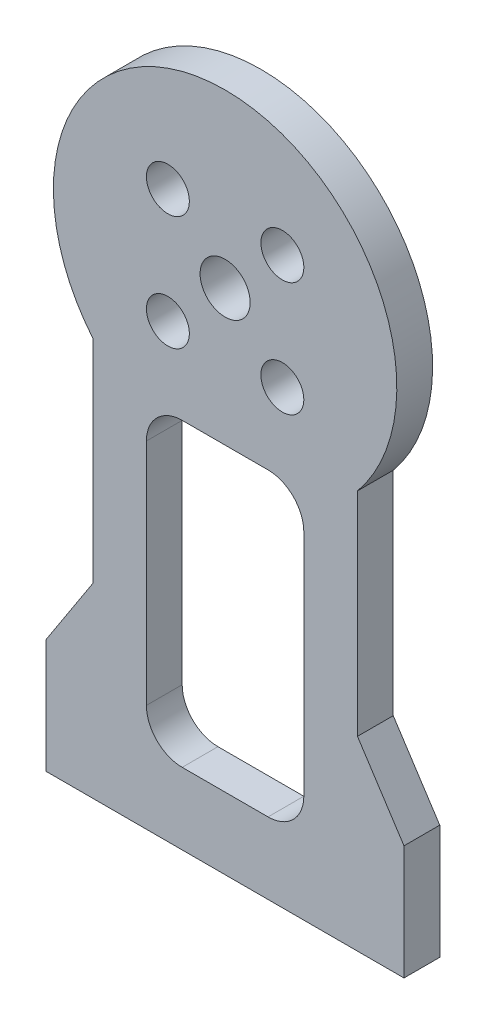
ISO-10303-21;
HEADER;
FILE_DESCRIPTION(('STEP AP214'),'2;1');
FILE_NAME('part.step','',(''),(''),'','','');
FILE_SCHEMA(('AUTOMOTIVE_DESIGN { 1 0 10303 214 1 1 1 1 }'));
ENDSEC;
DATA;
#1=APPLICATION_CONTEXT('core data for automotive mechanical design processes');
#2=APPLICATION_PROTOCOL_DEFINITION('international standard','automotive_design',2000,#1);
#3=PRODUCT_CONTEXT('',#1,'mechanical');
#4=PRODUCT('Part','Part','',(#3));
#5=PRODUCT_RELATED_PRODUCT_CATEGORY('part','',(#4));
#6=PRODUCT_DEFINITION_FORMATION('','',#4);
#7=PRODUCT_DEFINITION_CONTEXT('part definition',#1,'design');
#8=PRODUCT_DEFINITION('design','',#6,#7);
#9=PRODUCT_DEFINITION_SHAPE('','',#8);
#10=(LENGTH_UNIT() NAMED_UNIT(*) SI_UNIT(.MILLI.,.METRE.));
#11=(NAMED_UNIT(*) PLANE_ANGLE_UNIT() SI_UNIT($,.RADIAN.));
#12=(NAMED_UNIT(*) SI_UNIT($,.STERADIAN.) SOLID_ANGLE_UNIT());
#13=UNCERTAINTY_MEASURE_WITH_UNIT(LENGTH_MEASURE(1.E-05),#10,'distance_accuracy_value','');
#14=(GEOMETRIC_REPRESENTATION_CONTEXT(3) GLOBAL_UNCERTAINTY_ASSIGNED_CONTEXT((#13)) GLOBAL_UNIT_ASSIGNED_CONTEXT((#10,
#11,#12)) REPRESENTATION_CONTEXT('',''));
#15=CARTESIAN_POINT('',(0.,0.,0.));
#16=DIRECTION('',(0.,0.,1.));
#17=DIRECTION('',(1.,0.,0.));
#18=AXIS2_PLACEMENT_3D('',#15,#16,#17);
#19=CARTESIAN_POINT('',(0.,35.5,2.5));
#20=DIRECTION('',(0.,0.,1.));
#21=DIRECTION('',(1.,0.,0.));
#22=AXIS2_PLACEMENT_3D('',#19,#20,#21);
#23=PLANE('',#22);
#24=CARTESIAN_POINT('',(4.00000000000001,31.5,2.5));
#25=DIRECTION('',(0.,0.,1.));
#26=DIRECTION('',(1.,0.,0.));
#27=AXIS2_PLACEMENT_3D('',#24,#25,#26);
#28=CIRCLE('',#27,1.5);
#29=CARTESIAN_POINT('',(5.50000000000001,31.5,2.5));
#30=VERTEX_POINT('',#29);
#31=EDGE_CURVE('E391',#30,#30,#28,.T.);
#32=ORIENTED_EDGE('',*,*,#31,.F.);
#33=EDGE_LOOP('',(#32));
#34=FACE_BOUND('',#33,.T.);
#35=CARTESIAN_POINT('',(-4.,39.5,2.5));
#36=DIRECTION('',(0.,0.,1.));
#37=DIRECTION('',(1.,0.,0.));
#38=AXIS2_PLACEMENT_3D('',#35,#36,#37);
#39=CIRCLE('',#38,1.5);
#40=CARTESIAN_POINT('',(-2.5,39.5,2.5));
#41=VERTEX_POINT('',#40);
#42=EDGE_CURVE('E403',#41,#41,#39,.T.);
#43=ORIENTED_EDGE('',*,*,#42,.F.);
#44=EDGE_LOOP('',(#43));
#45=FACE_BOUND('',#44,.T.);
#46=DIRECTION('',(0.,1.,0.));
#47=VECTOR('',#46,1.);
#48=CARTESIAN_POINT('',(5.5,7.50000000000002,2.5));
#49=LINE('',#48,#47);
#50=CARTESIAN_POINT('',(5.5,7.50000000000002,2.5));
#51=VERTEX_POINT('',#50);
#52=CARTESIAN_POINT('',(5.5,23.5,2.5));
#53=VERTEX_POINT('',#52);
#54=EDGE_CURVE('E153',#51,#53,#49,.T.);
#55=ORIENTED_EDGE('',*,*,#54,.F.);
#56=CARTESIAN_POINT('',(3.,7.5,2.5));
#57=DIRECTION('',(0.,0.,1.));
#58=DIRECTION('',(1.,0.,0.));
#59=AXIS2_PLACEMENT_3D('',#56,#57,#58);
#60=CIRCLE('',#59,2.5);
#61=CARTESIAN_POINT('',(2.99999999999998,5.,2.5));
#62=VERTEX_POINT('',#61);
#63=EDGE_CURVE('E145',#62,#51,#60,.T.);
#64=ORIENTED_EDGE('',*,*,#63,.F.);
#65=DIRECTION('',(1.,0.,0.));
#66=VECTOR('',#65,1.);
#67=CARTESIAN_POINT('',(2.99999999999998,5.,2.5));
#68=LINE('',#67,#66);
#69=CARTESIAN_POINT('',(-2.99999999999998,5.,2.5));
#70=VERTEX_POINT('',#69);
#71=EDGE_CURVE('E180',#70,#62,#68,.T.);
#72=ORIENTED_EDGE('',*,*,#71,.F.);
#73=CARTESIAN_POINT('',(-3.,7.5,2.5));
#74=DIRECTION('',(0.,0.,1.));
#75=DIRECTION('',(-1.,0.,0.));
#76=AXIS2_PLACEMENT_3D('',#73,#74,#75);
#77=CIRCLE('',#76,2.5);
#78=CARTESIAN_POINT('',(-5.5,7.5,2.5));
#79=VERTEX_POINT('',#78);
#80=EDGE_CURVE('E178',#79,#70,#77,.T.);
#81=ORIENTED_EDGE('',*,*,#80,.F.);
#82=DIRECTION('',(0.,-1.,0.));
#83=VECTOR('',#82,1.);
#84=CARTESIAN_POINT('',(-5.5,7.50000000000002,2.5));
#85=LINE('',#84,#83);
#86=CARTESIAN_POINT('',(-5.5,23.5,2.5));
#87=VERTEX_POINT('',#86);
#88=EDGE_CURVE('E176',#87,#79,#85,.T.);
#89=ORIENTED_EDGE('',*,*,#88,.F.);
#90=CARTESIAN_POINT('',(-3.,23.5,2.5));
#91=DIRECTION('',(0.,0.,1.));
#92=DIRECTION('',(-1.,0.,0.));
#93=AXIS2_PLACEMENT_3D('',#90,#91,#92);
#94=CIRCLE('',#93,2.5);
#95=CARTESIAN_POINT('',(-2.99999999999998,26.,2.5));
#96=VERTEX_POINT('',#95);
#97=EDGE_CURVE('E174',#96,#87,#94,.T.);
#98=ORIENTED_EDGE('',*,*,#97,.F.);
#99=DIRECTION('',(-1.,0.,0.));
#100=VECTOR('',#99,1.);
#101=CARTESIAN_POINT('',(-2.99999999999998,26.,2.5));
#102=LINE('',#101,#100);
#103=CARTESIAN_POINT('',(2.99999999999998,26.,2.5));
#104=VERTEX_POINT('',#103);
#105=EDGE_CURVE('E169',#104,#96,#102,.T.);
#106=ORIENTED_EDGE('',*,*,#105,.F.);
#107=CARTESIAN_POINT('',(3.,23.5,2.5));
#108=DIRECTION('',(0.,0.,1.));
#109=DIRECTION('',(1.,0.,0.));
#110=AXIS2_PLACEMENT_3D('',#107,#108,#109);
#111=CIRCLE('',#110,2.5);
#112=EDGE_CURVE('E167',#53,#104,#111,.T.);
#113=ORIENTED_EDGE('',*,*,#112,.F.);
#114=EDGE_LOOP('',(#55,#64,#72,#81,#89,#98,#106,#113));
#115=FACE_BOUND('',#114,.T.);
#116=DIRECTION('',(0.,1.,0.));
#117=VECTOR('',#116,1.);
#118=CARTESIAN_POINT('',(12.5,0.,2.5));
#119=LINE('',#118,#117);
#120=CARTESIAN_POINT('',(12.5,0.,2.5));
#121=VERTEX_POINT('',#120);
#122=CARTESIAN_POINT('',(12.5,8.,2.5));
#123=VERTEX_POINT('',#122);
#124=EDGE_CURVE('E213',#121,#123,#119,.T.);
#125=ORIENTED_EDGE('',*,*,#124,.T.);
#126=DIRECTION('',(-0.544988350595414,0.838443616300637,0.));
#127=VECTOR('',#126,1.);
#128=CARTESIAN_POINT('',(12.5,8.,2.5));
#129=LINE('',#128,#127);
#130=CARTESIAN_POINT('',(9.25,13.,2.5));
#131=VERTEX_POINT('',#130);
#132=EDGE_CURVE('E216',#123,#131,#129,.T.);
#133=ORIENTED_EDGE('',*,*,#132,.T.);
#134=DIRECTION('',(0.,1.,0.));
#135=VECTOR('',#134,1.);
#136=CARTESIAN_POINT('',(9.25,13.,2.5));
#137=LINE('',#136,#135);
#138=CARTESIAN_POINT('',(9.24999999999999,27.8555575742897,2.5));
#139=VERTEX_POINT('',#138);
#140=EDGE_CURVE('E219',#131,#139,#137,.T.);
#141=ORIENTED_EDGE('',*,*,#140,.T.);
#142=CARTESIAN_POINT('',(0.,35.5,2.5));
#143=DIRECTION('',(0.,0.,1.));
#144=DIRECTION('',(1.,0.,0.));
#145=AXIS2_PLACEMENT_3D('',#142,#143,#144);
#146=CIRCLE('',#145,12.);
#147=CARTESIAN_POINT('',(-9.25,27.8555575742897,2.5));
#148=VERTEX_POINT('',#147);
#149=EDGE_CURVE('E221',#139,#148,#146,.T.);
#150=ORIENTED_EDGE('',*,*,#149,.T.);
#151=DIRECTION('',(0.,-1.,0.));
#152=VECTOR('',#151,1.);
#153=CARTESIAN_POINT('',(-9.25,13.,2.5));
#154=LINE('',#153,#152);
#155=CARTESIAN_POINT('',(-9.25,13.,2.5));
#156=VERTEX_POINT('',#155);
#157=EDGE_CURVE('E223',#148,#156,#154,.T.);
#158=ORIENTED_EDGE('',*,*,#157,.T.);
#159=DIRECTION('',(-0.544988350595414,-0.838443616300637,0.));
#160=VECTOR('',#159,1.);
#161=CARTESIAN_POINT('',(-12.5,8.,2.5));
#162=LINE('',#161,#160);
#163=CARTESIAN_POINT('',(-12.5,8.,2.5));
#164=VERTEX_POINT('',#163);
#165=EDGE_CURVE('E225',#156,#164,#162,.T.);
#166=ORIENTED_EDGE('',*,*,#165,.T.);
#167=DIRECTION('',(0.,-1.,0.));
#168=VECTOR('',#167,1.);
#169=CARTESIAN_POINT('',(-12.5,0.,2.5));
#170=LINE('',#169,#168);
#171=CARTESIAN_POINT('',(-12.5,0.,2.5));
#172=VERTEX_POINT('',#171);
#173=EDGE_CURVE('E227',#164,#172,#170,.T.);
#174=ORIENTED_EDGE('',*,*,#173,.T.);
#175=DIRECTION('',(1.,0.,0.));
#176=VECTOR('',#175,1.);
#177=CARTESIAN_POINT('',(12.5,0.,2.5));
#178=LINE('',#177,#176);
#179=EDGE_CURVE('E229',#172,#121,#178,.T.);
#180=ORIENTED_EDGE('',*,*,#179,.T.);
#181=EDGE_LOOP('',(#125,#133,#141,#150,#158,#166,#174,#180));
#182=FACE_BOUND('',#181,.T.);
#183=CARTESIAN_POINT('',(0.,35.5,2.5));
#184=DIRECTION('',(0.,0.,1.));
#185=DIRECTION('',(1.,0.,0.));
#186=AXIS2_PLACEMENT_3D('',#183,#184,#185);
#187=CIRCLE('',#186,1.75);
#188=CARTESIAN_POINT('',(1.75,35.5,2.5));
#189=VERTEX_POINT('',#188);
#190=EDGE_CURVE('E183',#189,#189,#187,.T.);
#191=ORIENTED_EDGE('',*,*,#190,.F.);
#192=EDGE_LOOP('',(#191));
#193=FACE_BOUND('',#192,.T.);
#194=CARTESIAN_POINT('',(-4.00000000000001,31.5,2.5));
#195=DIRECTION('',(0.,0.,1.));
#196=DIRECTION('',(-1.,0.,0.));
#197=AXIS2_PLACEMENT_3D('',#194,#195,#196);
#198=CIRCLE('',#197,1.5);
#199=CARTESIAN_POINT('',(-5.50000000000001,31.5,2.5));
#200=VERTEX_POINT('',#199);
#201=EDGE_CURVE('E397',#200,#200,#198,.T.);
#202=ORIENTED_EDGE('',*,*,#201,.F.);
#203=EDGE_LOOP('',(#202));
#204=FACE_BOUND('',#203,.T.);
#205=CARTESIAN_POINT('',(4.,39.5,2.5));
#206=DIRECTION('',(0.,0.,1.));
#207=DIRECTION('',(-1.,0.,0.));
#208=AXIS2_PLACEMENT_3D('',#205,#206,#207);
#209=CIRCLE('',#208,1.5);
#210=CARTESIAN_POINT('',(2.5,39.5,2.5));
#211=VERTEX_POINT('',#210);
#212=EDGE_CURVE('E382',#211,#211,#209,.T.);
#213=ORIENTED_EDGE('',*,*,#212,.F.);
#214=EDGE_LOOP('',(#213));
#215=FACE_BOUND('',#214,.T.);
#216=ADVANCED_FACE('F32',(#34,#45,#115,#182,#193,#204,#215),#23,.T.);
#217=CARTESIAN_POINT('',(0.,35.5,0.));
#218=DIRECTION('',(0.,0.,1.));
#219=DIRECTION('',(1.,0.,0.));
#220=AXIS2_PLACEMENT_3D('',#217,#218,#219);
#221=PLANE('',#220);
#222=DIRECTION('',(0.,1.,0.));
#223=VECTOR('',#222,1.);
#224=CARTESIAN_POINT('',(12.5,0.,0.));
#225=LINE('',#224,#223);
#226=CARTESIAN_POINT('',(12.5,0.,0.));
#227=VERTEX_POINT('',#226);
#228=CARTESIAN_POINT('',(12.5,8.,0.));
#229=VERTEX_POINT('',#228);
#230=EDGE_CURVE('E161',#227,#229,#225,.T.);
#231=ORIENTED_EDGE('',*,*,#230,.F.);
#232=DIRECTION('',(1.,0.,0.));
#233=VECTOR('',#232,1.);
#234=CARTESIAN_POINT('',(12.5,0.,0.));
#235=LINE('',#234,#233);
#236=CARTESIAN_POINT('',(-12.5,0.,0.));
#237=VERTEX_POINT('',#236);
#238=EDGE_CURVE('E217',#237,#227,#235,.T.);
#239=ORIENTED_EDGE('',*,*,#238,.F.);
#240=DIRECTION('',(0.,-1.,0.));
#241=VECTOR('',#240,1.);
#242=CARTESIAN_POINT('',(-12.5,0.,0.));
#243=LINE('',#242,#241);
#244=CARTESIAN_POINT('',(-12.5,8.,0.));
#245=VERTEX_POINT('',#244);
#246=EDGE_CURVE('E244',#245,#237,#243,.T.);
#247=ORIENTED_EDGE('',*,*,#246,.F.);
#248=DIRECTION('',(-0.544988350595414,-0.838443616300637,0.));
#249=VECTOR('',#248,1.);
#250=CARTESIAN_POINT('',(-12.5,8.,0.));
#251=LINE('',#250,#249);
#252=CARTESIAN_POINT('',(-9.25,13.,0.));
#253=VERTEX_POINT('',#252);
#254=EDGE_CURVE('E242',#253,#245,#251,.T.);
#255=ORIENTED_EDGE('',*,*,#254,.F.);
#256=DIRECTION('',(0.,-1.,0.));
#257=VECTOR('',#256,1.);
#258=CARTESIAN_POINT('',(-9.25,13.,0.));
#259=LINE('',#258,#257);
#260=CARTESIAN_POINT('',(-9.25,27.8555575742897,0.));
#261=VERTEX_POINT('',#260);
#262=EDGE_CURVE('E240',#261,#253,#259,.T.);
#263=ORIENTED_EDGE('',*,*,#262,.F.);
#264=CARTESIAN_POINT('',(0.,35.5,0.));
#265=DIRECTION('',(0.,0.,1.));
#266=DIRECTION('',(1.,0.,0.));
#267=AXIS2_PLACEMENT_3D('',#264,#265,#266);
#268=CIRCLE('',#267,12.);
#269=CARTESIAN_POINT('',(9.24999999999999,27.8555575742897,0.));
#270=VERTEX_POINT('',#269);
#271=EDGE_CURVE('E238',#270,#261,#268,.T.);
#272=ORIENTED_EDGE('',*,*,#271,.F.);
#273=DIRECTION('',(0.,1.,0.));
#274=VECTOR('',#273,1.);
#275=CARTESIAN_POINT('',(9.25,13.,0.));
#276=LINE('',#275,#274);
#277=CARTESIAN_POINT('',(9.25,13.,0.));
#278=VERTEX_POINT('',#277);
#279=EDGE_CURVE('E236',#278,#270,#276,.T.);
#280=ORIENTED_EDGE('',*,*,#279,.F.);
#281=DIRECTION('',(-0.544988350595414,0.838443616300637,0.));
#282=VECTOR('',#281,1.);
#283=CARTESIAN_POINT('',(12.5,8.,0.));
#284=LINE('',#283,#282);
#285=EDGE_CURVE('E234',#229,#278,#284,.T.);
#286=ORIENTED_EDGE('',*,*,#285,.F.);
#287=EDGE_LOOP('',(#231,#239,#247,#255,#263,#272,#280,#286));
#288=FACE_BOUND('',#287,.T.);
#289=CARTESIAN_POINT('',(3.,7.5,0.));
#290=DIRECTION('',(0.,0.,1.));
#291=DIRECTION('',(1.,0.,0.));
#292=AXIS2_PLACEMENT_3D('',#289,#290,#291);
#293=CIRCLE('',#292,2.5);
#294=CARTESIAN_POINT('',(2.99999999999998,5.,0.));
#295=VERTEX_POINT('',#294);
#296=CARTESIAN_POINT('',(5.5,7.50000000000002,0.));
#297=VERTEX_POINT('',#296);
#298=EDGE_CURVE('E55',#295,#297,#293,.T.);
#299=ORIENTED_EDGE('',*,*,#298,.T.);
#300=DIRECTION('',(0.,1.,0.));
#301=VECTOR('',#300,1.);
#302=CARTESIAN_POINT('',(5.5,7.50000000000002,0.));
#303=LINE('',#302,#301);
#304=CARTESIAN_POINT('',(5.5,23.5,0.));
#305=VERTEX_POINT('',#304);
#306=EDGE_CURVE('E160',#297,#305,#303,.T.);
#307=ORIENTED_EDGE('',*,*,#306,.T.);
#308=CARTESIAN_POINT('',(3.,23.5,0.));
#309=DIRECTION('',(0.,0.,1.));
#310=DIRECTION('',(1.,0.,0.));
#311=AXIS2_PLACEMENT_3D('',#308,#309,#310);
#312=CIRCLE('',#311,2.5);
#313=CARTESIAN_POINT('',(2.99999999999998,26.,0.));
#314=VERTEX_POINT('',#313);
#315=EDGE_CURVE('E185',#305,#314,#312,.T.);
#316=ORIENTED_EDGE('',*,*,#315,.T.);
#317=DIRECTION('',(-1.,0.,0.));
#318=VECTOR('',#317,1.);
#319=CARTESIAN_POINT('',(-2.99999999999998,26.,0.));
#320=LINE('',#319,#318);
#321=CARTESIAN_POINT('',(-2.99999999999998,26.,0.));
#322=VERTEX_POINT('',#321);
#323=EDGE_CURVE('E188',#314,#322,#320,.T.);
#324=ORIENTED_EDGE('',*,*,#323,.T.);
#325=CARTESIAN_POINT('',(-3.,23.5,0.));
#326=DIRECTION('',(0.,0.,1.));
#327=DIRECTION('',(-1.,0.,0.));
#328=AXIS2_PLACEMENT_3D('',#325,#326,#327);
#329=CIRCLE('',#328,2.5);
#330=CARTESIAN_POINT('',(-5.5,23.5,0.));
#331=VERTEX_POINT('',#330);
#332=EDGE_CURVE('E191',#322,#331,#329,.T.);
#333=ORIENTED_EDGE('',*,*,#332,.T.);
#334=DIRECTION('',(0.,-1.,0.));
#335=VECTOR('',#334,1.);
#336=CARTESIAN_POINT('',(-5.5,7.50000000000002,0.));
#337=LINE('',#336,#335);
#338=CARTESIAN_POINT('',(-5.5,7.5,0.));
#339=VERTEX_POINT('',#338);
#340=EDGE_CURVE('E194',#331,#339,#337,.T.);
#341=ORIENTED_EDGE('',*,*,#340,.T.);
#342=CARTESIAN_POINT('',(-3.,7.5,0.));
#343=DIRECTION('',(0.,0.,1.));
#344=DIRECTION('',(-1.,0.,0.));
#345=AXIS2_PLACEMENT_3D('',#342,#343,#344);
#346=CIRCLE('',#345,2.5);
#347=CARTESIAN_POINT('',(-2.99999999999998,5.,0.));
#348=VERTEX_POINT('',#347);
#349=EDGE_CURVE('E197',#339,#348,#346,.T.);
#350=ORIENTED_EDGE('',*,*,#349,.T.);
#351=DIRECTION('',(1.,0.,0.));
#352=VECTOR('',#351,1.);
#353=CARTESIAN_POINT('',(2.99999999999998,5.,0.));
#354=LINE('',#353,#352);
#355=EDGE_CURVE('E154',#348,#295,#354,.T.);
#356=ORIENTED_EDGE('',*,*,#355,.T.);
#357=EDGE_LOOP('',(#299,#307,#316,#324,#333,#341,#350,#356));
#358=FACE_BOUND('',#357,.T.);
#359=CARTESIAN_POINT('',(0.,35.5,0.));
#360=DIRECTION('',(0.,0.,1.));
#361=DIRECTION('',(1.,0.,0.));
#362=AXIS2_PLACEMENT_3D('',#359,#360,#361);
#363=CIRCLE('',#362,1.75);
#364=CARTESIAN_POINT('',(1.75,35.5,0.));
#365=VERTEX_POINT('',#364);
#366=EDGE_CURVE('E406',#365,#365,#363,.T.);
#367=ORIENTED_EDGE('',*,*,#366,.T.);
#368=EDGE_LOOP('',(#367));
#369=FACE_BOUND('',#368,.T.);
#370=CARTESIAN_POINT('',(-4.,39.5,0.));
#371=DIRECTION('',(0.,0.,1.));
#372=DIRECTION('',(1.,0.,0.));
#373=AXIS2_PLACEMENT_3D('',#370,#371,#372);
#374=CIRCLE('',#373,1.5);
#375=CARTESIAN_POINT('',(-2.5,39.5,0.));
#376=VERTEX_POINT('',#375);
#377=EDGE_CURVE('E400',#376,#376,#374,.T.);
#378=ORIENTED_EDGE('',*,*,#377,.T.);
#379=EDGE_LOOP('',(#378));
#380=FACE_BOUND('',#379,.T.);
#381=CARTESIAN_POINT('',(-4.00000000000001,31.5,0.));
#382=DIRECTION('',(0.,0.,1.));
#383=DIRECTION('',(-1.,0.,0.));
#384=AXIS2_PLACEMENT_3D('',#381,#382,#383);
#385=CIRCLE('',#384,1.5);
#386=CARTESIAN_POINT('',(-5.50000000000001,31.5,0.));
#387=VERTEX_POINT('',#386);
#388=EDGE_CURVE('E394',#387,#387,#385,.T.);
#389=ORIENTED_EDGE('',*,*,#388,.T.);
#390=EDGE_LOOP('',(#389));
#391=FACE_BOUND('',#390,.T.);
#392=CARTESIAN_POINT('',(4.00000000000001,31.5,0.));
#393=DIRECTION('',(0.,0.,1.));
#394=DIRECTION('',(1.,0.,0.));
#395=AXIS2_PLACEMENT_3D('',#392,#393,#394);
#396=CIRCLE('',#395,1.5);
#397=CARTESIAN_POINT('',(5.50000000000001,31.5,0.));
#398=VERTEX_POINT('',#397);
#399=EDGE_CURVE('E388',#398,#398,#396,.T.);
#400=ORIENTED_EDGE('',*,*,#399,.T.);
#401=EDGE_LOOP('',(#400));
#402=FACE_BOUND('',#401,.T.);
#403=CARTESIAN_POINT('',(4.,39.5,0.));
#404=DIRECTION('',(0.,0.,1.));
#405=DIRECTION('',(-1.,0.,0.));
#406=AXIS2_PLACEMENT_3D('',#403,#404,#405);
#407=CIRCLE('',#406,1.5);
#408=CARTESIAN_POINT('',(2.5,39.5,0.));
#409=VERTEX_POINT('',#408);
#410=EDGE_CURVE('E385',#409,#409,#407,.T.);
#411=ORIENTED_EDGE('',*,*,#410,.T.);
#412=EDGE_LOOP('',(#411));
#413=FACE_BOUND('',#412,.T.);
#414=ADVANCED_FACE('F274',(#288,#358,#369,#380,#391,#402,#413),#221,.F.);
#415=CARTESIAN_POINT('',(12.5,0.,2.5));
#416=DIRECTION('',(-1.,0.,0.));
#417=DIRECTION('',(0.,-1.,0.));
#418=AXIS2_PLACEMENT_3D('',#415,#416,#417);
#419=PLANE('',#418);
#420=ORIENTED_EDGE('',*,*,#230,.T.);
#421=DIRECTION('',(0.,0.,-1.));
#422=VECTOR('',#421,1.);
#423=CARTESIAN_POINT('',(12.5,8.,2.5));
#424=LINE('',#423,#422);
#425=EDGE_CURVE('E11',#123,#229,#424,.T.);
#426=ORIENTED_EDGE('',*,*,#425,.F.);
#427=ORIENTED_EDGE('',*,*,#124,.F.);
#428=DIRECTION('',(0.,0.,-1.));
#429=VECTOR('',#428,1.);
#430=CARTESIAN_POINT('',(12.5,0.,2.5));
#431=LINE('',#430,#429);
#432=EDGE_CURVE('E231',#121,#227,#431,.T.);
#433=ORIENTED_EDGE('',*,*,#432,.T.);
#434=EDGE_LOOP('',(#420,#426,#427,#433));
#435=FACE_BOUND('',#434,.T.);
#436=ADVANCED_FACE('F34',(#435),#419,.F.);
#437=CARTESIAN_POINT('',(12.5,8.,2.5));
#438=DIRECTION('',(-0.838443616300637,-0.544988350595414,0.));
#439=DIRECTION('',(0.544988350595414,-0.838443616300637,0.));
#440=AXIS2_PLACEMENT_3D('',#437,#438,#439);
#441=PLANE('',#440);
#442=ORIENTED_EDGE('',*,*,#285,.T.);
#443=DIRECTION('',(0.,0.,-1.));
#444=VECTOR('',#443,1.);
#445=CARTESIAN_POINT('',(9.25,13.,2.5));
#446=LINE('',#445,#444);
#447=EDGE_CURVE('E40',#131,#278,#446,.T.);
#448=ORIENTED_EDGE('',*,*,#447,.F.);
#449=ORIENTED_EDGE('',*,*,#132,.F.);
#450=ORIENTED_EDGE('',*,*,#425,.T.);
#451=EDGE_LOOP('',(#442,#448,#449,#450));
#452=FACE_BOUND('',#451,.T.);
#453=ADVANCED_FACE('F291',(#452),#441,.F.);
#454=CARTESIAN_POINT('',(9.25,13.,2.5));
#455=DIRECTION('',(-1.,0.,0.));
#456=DIRECTION('',(0.,0.,1.));
#457=AXIS2_PLACEMENT_3D('',#454,#455,#456);
#458=PLANE('',#457);
#459=ORIENTED_EDGE('',*,*,#279,.T.);
#460=DIRECTION('',(0.,0.,-1.));
#461=VECTOR('',#460,1.);
#462=CARTESIAN_POINT('',(9.24999999999999,27.8555575742897,2.5));
#463=LINE('',#462,#461);
#464=EDGE_CURVE('E261',#139,#270,#463,.T.);
#465=ORIENTED_EDGE('',*,*,#464,.F.);
#466=ORIENTED_EDGE('',*,*,#140,.F.);
#467=ORIENTED_EDGE('',*,*,#447,.T.);
#468=EDGE_LOOP('',(#459,#465,#466,#467));
#469=FACE_BOUND('',#468,.T.);
#470=ADVANCED_FACE('F268',(#469),#458,.F.);
#471=CARTESIAN_POINT('',(0.,35.5,2.5));
#472=DIRECTION('',(0.,0.,-1.));
#473=DIRECTION('',(-1.,0.,0.));
#474=AXIS2_PLACEMENT_3D('',#471,#472,#473);
#475=CYLINDRICAL_SURFACE('',#474,12.);
#476=ORIENTED_EDGE('',*,*,#271,.T.);
#477=DIRECTION('',(0.,0.,-1.));
#478=VECTOR('',#477,1.);
#479=CARTESIAN_POINT('',(-9.25,27.8555575742897,2.5));
#480=LINE('',#479,#478);
#481=EDGE_CURVE('E258',#148,#261,#480,.T.);
#482=ORIENTED_EDGE('',*,*,#481,.F.);
#483=ORIENTED_EDGE('',*,*,#149,.F.);
#484=ORIENTED_EDGE('',*,*,#464,.T.);
#485=EDGE_LOOP('',(#476,#482,#483,#484));
#486=FACE_BOUND('',#485,.T.);
#487=ADVANCED_FACE('F280',(#486),#475,.T.);
#488=CARTESIAN_POINT('',(-9.25,13.,2.5));
#489=DIRECTION('',(1.,0.,0.));
#490=DIRECTION('',(0.,0.,-1.));
#491=AXIS2_PLACEMENT_3D('',#488,#489,#490);
#492=PLANE('',#491);
#493=ORIENTED_EDGE('',*,*,#262,.T.);
#494=DIRECTION('',(0.,0.,-1.));
#495=VECTOR('',#494,1.);
#496=CARTESIAN_POINT('',(-9.25,13.,2.5));
#497=LINE('',#496,#495);
#498=EDGE_CURVE('E255',#156,#253,#497,.T.);
#499=ORIENTED_EDGE('',*,*,#498,.F.);
#500=ORIENTED_EDGE('',*,*,#157,.F.);
#501=ORIENTED_EDGE('',*,*,#481,.T.);
#502=EDGE_LOOP('',(#493,#499,#500,#501));
#503=FACE_BOUND('',#502,.T.);
#504=ADVANCED_FACE('F284',(#503),#492,.F.);
#505=CARTESIAN_POINT('',(-12.5,8.,2.5));
#506=DIRECTION('',(0.838443616300637,-0.544988350595414,0.));
#507=DIRECTION('',(0.544988350595414,0.838443616300637,0.));
#508=AXIS2_PLACEMENT_3D('',#505,#506,#507);
#509=PLANE('',#508);
#510=ORIENTED_EDGE('',*,*,#254,.T.);
#511=DIRECTION('',(0.,0.,-1.));
#512=VECTOR('',#511,1.);
#513=CARTESIAN_POINT('',(-12.5,8.,2.5));
#514=LINE('',#513,#512);
#515=EDGE_CURVE('E252',#164,#245,#514,.T.);
#516=ORIENTED_EDGE('',*,*,#515,.F.);
#517=ORIENTED_EDGE('',*,*,#165,.F.);
#518=ORIENTED_EDGE('',*,*,#498,.T.);
#519=EDGE_LOOP('',(#510,#516,#517,#518));
#520=FACE_BOUND('',#519,.T.);
#521=ADVANCED_FACE('F304',(#520),#509,.F.);
#522=CARTESIAN_POINT('',(-12.5,0.,2.5));
#523=DIRECTION('',(1.,0.,0.));
#524=DIRECTION('',(0.,1.,0.));
#525=AXIS2_PLACEMENT_3D('',#522,#523,#524);
#526=PLANE('',#525);
#527=ORIENTED_EDGE('',*,*,#246,.T.);
#528=DIRECTION('',(0.,0.,-1.));
#529=VECTOR('',#528,1.);
#530=CARTESIAN_POINT('',(-12.5,0.,2.5));
#531=LINE('',#530,#529);
#532=EDGE_CURVE('E249',#172,#237,#531,.T.);
#533=ORIENTED_EDGE('',*,*,#532,.F.);
#534=ORIENTED_EDGE('',*,*,#173,.F.);
#535=ORIENTED_EDGE('',*,*,#515,.T.);
#536=EDGE_LOOP('',(#527,#533,#534,#535));
#537=FACE_BOUND('',#536,.T.);
#538=ADVANCED_FACE('F302',(#537),#526,.F.);
#539=CARTESIAN_POINT('',(12.5,0.,2.5));
#540=DIRECTION('',(0.,1.,0.));
#541=DIRECTION('',(0.,0.,1.));
#542=AXIS2_PLACEMENT_3D('',#539,#540,#541);
#543=PLANE('',#542);
#544=ORIENTED_EDGE('',*,*,#238,.T.);
#545=ORIENTED_EDGE('',*,*,#432,.F.);
#546=ORIENTED_EDGE('',*,*,#179,.F.);
#547=ORIENTED_EDGE('',*,*,#532,.T.);
#548=EDGE_LOOP('',(#544,#545,#546,#547));
#549=FACE_BOUND('',#548,.T.);
#550=ADVANCED_FACE('F297',(#549),#543,.F.);
#551=CARTESIAN_POINT('',(3.,7.5,2.5));
#552=DIRECTION('',(0.,0.,-1.));
#553=DIRECTION('',(-1.,0.,0.));
#554=AXIS2_PLACEMENT_3D('',#551,#552,#553);
#555=CYLINDRICAL_SURFACE('',#554,2.5);
#556=ORIENTED_EDGE('',*,*,#298,.F.);
#557=DIRECTION('',(0.,0.,-1.));
#558=VECTOR('',#557,1.);
#559=CARTESIAN_POINT('',(2.99999999999998,5.,2.5));
#560=LINE('',#559,#558);
#561=EDGE_CURVE('E149',#62,#295,#560,.T.);
#562=ORIENTED_EDGE('',*,*,#561,.F.);
#563=ORIENTED_EDGE('',*,*,#63,.T.);
#564=DIRECTION('',(0.,0.,-1.));
#565=VECTOR('',#564,1.);
#566=CARTESIAN_POINT('',(5.5,7.50000000000002,2.5));
#567=LINE('',#566,#565);
#568=EDGE_CURVE('E148',#51,#297,#567,.T.);
#569=ORIENTED_EDGE('',*,*,#568,.T.);
#570=EDGE_LOOP('',(#556,#562,#563,#569));
#571=FACE_BOUND('',#570,.T.);
#572=ADVANCED_FACE('F147',(#571),#555,.F.);
#573=CARTESIAN_POINT('',(5.5,7.50000000000002,2.5));
#574=DIRECTION('',(-1.,0.,0.));
#575=DIRECTION('',(0.,0.,1.));
#576=AXIS2_PLACEMENT_3D('',#573,#574,#575);
#577=PLANE('',#576);
#578=ORIENTED_EDGE('',*,*,#306,.F.);
#579=ORIENTED_EDGE('',*,*,#568,.F.);
#580=ORIENTED_EDGE('',*,*,#54,.T.);
#581=DIRECTION('',(0.,0.,-1.));
#582=VECTOR('',#581,1.);
#583=CARTESIAN_POINT('',(5.5,23.5,2.5));
#584=LINE('',#583,#582);
#585=EDGE_CURVE('E162',#53,#305,#584,.T.);
#586=ORIENTED_EDGE('',*,*,#585,.T.);
#587=EDGE_LOOP('',(#578,#579,#580,#586));
#588=FACE_BOUND('',#587,.T.);
#589=ADVANCED_FACE('F157',(#588),#577,.T.);
#590=CARTESIAN_POINT('',(3.,23.5,2.5));
#591=DIRECTION('',(0.,0.,-1.));
#592=DIRECTION('',(-1.,0.,0.));
#593=AXIS2_PLACEMENT_3D('',#590,#591,#592);
#594=CYLINDRICAL_SURFACE('',#593,2.5);
#595=ORIENTED_EDGE('',*,*,#315,.F.);
#596=ORIENTED_EDGE('',*,*,#585,.F.);
#597=ORIENTED_EDGE('',*,*,#112,.T.);
#598=DIRECTION('',(0.,0.,-1.));
#599=VECTOR('',#598,1.);
#600=CARTESIAN_POINT('',(2.99999999999998,26.,2.5));
#601=LINE('',#600,#599);
#602=EDGE_CURVE('E210',#104,#314,#601,.T.);
#603=ORIENTED_EDGE('',*,*,#602,.T.);
#604=EDGE_LOOP('',(#595,#596,#597,#603));
#605=FACE_BOUND('',#604,.T.);
#606=ADVANCED_FACE('F332',(#605),#594,.F.);
#607=CARTESIAN_POINT('',(-2.99999999999998,26.,2.5));
#608=DIRECTION('',(0.,-1.,0.));
#609=DIRECTION('',(0.,0.,-1.));
#610=AXIS2_PLACEMENT_3D('',#607,#608,#609);
#611=PLANE('',#610);
#612=ORIENTED_EDGE('',*,*,#323,.F.);
#613=ORIENTED_EDGE('',*,*,#602,.F.);
#614=ORIENTED_EDGE('',*,*,#105,.T.);
#615=DIRECTION('',(0.,0.,-1.));
#616=VECTOR('',#615,1.);
#617=CARTESIAN_POINT('',(-2.99999999999998,26.,2.5));
#618=LINE('',#617,#616);
#619=EDGE_CURVE('E208',#96,#322,#618,.T.);
#620=ORIENTED_EDGE('',*,*,#619,.T.);
#621=EDGE_LOOP('',(#612,#613,#614,#620));
#622=FACE_BOUND('',#621,.T.);
#623=ADVANCED_FACE('F336',(#622),#611,.T.);
#624=CARTESIAN_POINT('',(-3.,23.5,2.5));
#625=DIRECTION('',(0.,0.,-1.));
#626=DIRECTION('',(-1.,0.,0.));
#627=AXIS2_PLACEMENT_3D('',#624,#625,#626);
#628=CYLINDRICAL_SURFACE('',#627,2.5);
#629=ORIENTED_EDGE('',*,*,#332,.F.);
#630=ORIENTED_EDGE('',*,*,#619,.F.);
#631=ORIENTED_EDGE('',*,*,#97,.T.);
#632=DIRECTION('',(0.,0.,-1.));
#633=VECTOR('',#632,1.);
#634=CARTESIAN_POINT('',(-5.5,23.5,2.5));
#635=LINE('',#634,#633);
#636=EDGE_CURVE('E206',#87,#331,#635,.T.);
#637=ORIENTED_EDGE('',*,*,#636,.T.);
#638=EDGE_LOOP('',(#629,#630,#631,#637));
#639=FACE_BOUND('',#638,.T.);
#640=ADVANCED_FACE('F342',(#639),#628,.F.);
#641=CARTESIAN_POINT('',(-5.5,7.50000000000002,2.5));
#642=DIRECTION('',(1.,0.,0.));
#643=DIRECTION('',(0.,0.,-1.));
#644=AXIS2_PLACEMENT_3D('',#641,#642,#643);
#645=PLANE('',#644);
#646=ORIENTED_EDGE('',*,*,#340,.F.);
#647=ORIENTED_EDGE('',*,*,#636,.F.);
#648=ORIENTED_EDGE('',*,*,#88,.T.);
#649=DIRECTION('',(0.,0.,-1.));
#650=VECTOR('',#649,1.);
#651=CARTESIAN_POINT('',(-5.5,7.5,2.5));
#652=LINE('',#651,#650);
#653=EDGE_CURVE('E204',#79,#339,#652,.T.);
#654=ORIENTED_EDGE('',*,*,#653,.T.);
#655=EDGE_LOOP('',(#646,#647,#648,#654));
#656=FACE_BOUND('',#655,.T.);
#657=ADVANCED_FACE('F346',(#656),#645,.T.);
#658=CARTESIAN_POINT('',(-3.,7.5,2.5));
#659=DIRECTION('',(0.,0.,-1.));
#660=DIRECTION('',(-1.,0.,0.));
#661=AXIS2_PLACEMENT_3D('',#658,#659,#660);
#662=CYLINDRICAL_SURFACE('',#661,2.5);
#663=ORIENTED_EDGE('',*,*,#349,.F.);
#664=ORIENTED_EDGE('',*,*,#653,.F.);
#665=ORIENTED_EDGE('',*,*,#80,.T.);
#666=DIRECTION('',(0.,0.,-1.));
#667=VECTOR('',#666,1.);
#668=CARTESIAN_POINT('',(-2.99999999999998,5.,2.5));
#669=LINE('',#668,#667);
#670=EDGE_CURVE('E47',#70,#348,#669,.T.);
#671=ORIENTED_EDGE('',*,*,#670,.T.);
#672=EDGE_LOOP('',(#663,#664,#665,#671));
#673=FACE_BOUND('',#672,.T.);
#674=ADVANCED_FACE('F350',(#673),#662,.F.);
#675=CARTESIAN_POINT('',(2.99999999999998,5.,2.5));
#676=DIRECTION('',(0.,1.,0.));
#677=DIRECTION('',(0.,0.,1.));
#678=AXIS2_PLACEMENT_3D('',#675,#676,#677);
#679=PLANE('',#678);
#680=ORIENTED_EDGE('',*,*,#355,.F.);
#681=ORIENTED_EDGE('',*,*,#670,.F.);
#682=ORIENTED_EDGE('',*,*,#71,.T.);
#683=ORIENTED_EDGE('',*,*,#561,.T.);
#684=EDGE_LOOP('',(#680,#681,#682,#683));
#685=FACE_BOUND('',#684,.T.);
#686=ADVANCED_FACE('F354',(#685),#679,.T.);
#687=CARTESIAN_POINT('',(0.,35.5,2.5));
#688=DIRECTION('',(0.,0.,-1.));
#689=DIRECTION('',(-1.,0.,0.));
#690=AXIS2_PLACEMENT_3D('',#687,#688,#689);
#691=CYLINDRICAL_SURFACE('',#690,1.75);
#692=ORIENTED_EDGE('',*,*,#190,.T.);
#693=EDGE_LOOP('',(#692));
#694=FACE_BOUND('',#693,.T.);
#695=ORIENTED_EDGE('',*,*,#366,.F.);
#696=EDGE_LOOP('',(#695));
#697=FACE_BOUND('',#696,.T.);
#698=ADVANCED_FACE('F358',(#694,#697),#691,.F.);
#699=CARTESIAN_POINT('',(-4.,39.5,2.5));
#700=DIRECTION('',(0.,0.,-1.));
#701=DIRECTION('',(-1.,0.,0.));
#702=AXIS2_PLACEMENT_3D('',#699,#700,#701);
#703=CYLINDRICAL_SURFACE('',#702,1.5);
#704=ORIENTED_EDGE('',*,*,#42,.T.);
#705=EDGE_LOOP('',(#704));
#706=FACE_BOUND('',#705,.T.);
#707=ORIENTED_EDGE('',*,*,#377,.F.);
#708=EDGE_LOOP('',(#707));
#709=FACE_BOUND('',#708,.T.);
#710=ADVANCED_FACE('F361',(#706,#709),#703,.F.);
#711=CARTESIAN_POINT('',(-4.00000000000001,31.5,2.5));
#712=DIRECTION('',(0.,0.,-1.));
#713=DIRECTION('',(-1.,0.,0.));
#714=AXIS2_PLACEMENT_3D('',#711,#712,#713);
#715=CYLINDRICAL_SURFACE('',#714,1.5);
#716=ORIENTED_EDGE('',*,*,#201,.T.);
#717=EDGE_LOOP('',(#716));
#718=FACE_BOUND('',#717,.T.);
#719=ORIENTED_EDGE('',*,*,#388,.F.);
#720=EDGE_LOOP('',(#719));
#721=FACE_BOUND('',#720,.T.);
#722=ADVANCED_FACE('F365',(#718,#721),#715,.F.);
#723=CARTESIAN_POINT('',(4.00000000000001,31.5,2.5));
#724=DIRECTION('',(0.,0.,-1.));
#725=DIRECTION('',(-1.,0.,0.));
#726=AXIS2_PLACEMENT_3D('',#723,#724,#725);
#727=CYLINDRICAL_SURFACE('',#726,1.5);
#728=ORIENTED_EDGE('',*,*,#31,.T.);
#729=EDGE_LOOP('',(#728));
#730=FACE_BOUND('',#729,.T.);
#731=ORIENTED_EDGE('',*,*,#399,.F.);
#732=EDGE_LOOP('',(#731));
#733=FACE_BOUND('',#732,.T.);
#734=ADVANCED_FACE('F369',(#730,#733),#727,.F.);
#735=CARTESIAN_POINT('',(4.,39.5,2.5));
#736=DIRECTION('',(0.,0.,-1.));
#737=DIRECTION('',(-1.,0.,0.));
#738=AXIS2_PLACEMENT_3D('',#735,#736,#737);
#739=CYLINDRICAL_SURFACE('',#738,1.5);
#740=ORIENTED_EDGE('',*,*,#212,.T.);
#741=EDGE_LOOP('',(#740));
#742=FACE_BOUND('',#741,.T.);
#743=ORIENTED_EDGE('',*,*,#410,.F.);
#744=EDGE_LOOP('',(#743));
#745=FACE_BOUND('',#744,.T.);
#746=ADVANCED_FACE('F373',(#742,#745),#739,.F.);
#747=CLOSED_SHELL('',(#216,#414,#436,#453,#470,#487,#504,#521,#538,#550,#572,#589,#606,#623,
#640,#657,#674,#686,#698,#710,#722,#734,#746));
#748=MANIFOLD_SOLID_BREP('B2',#747);
#749=ADVANCED_BREP_SHAPE_REPRESENTATION('',(#18,#748),#14);
#750=SHAPE_DEFINITION_REPRESENTATION(#9,#749);
ENDSEC;
END-ISO-10303-21;
